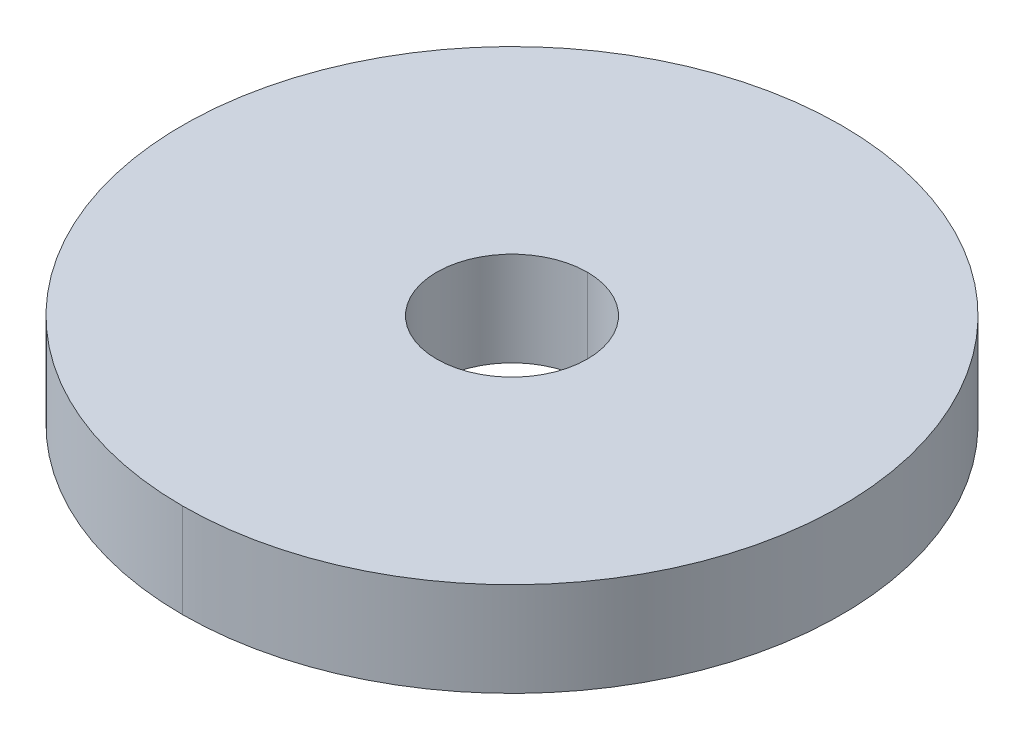
ISO-10303-21;
HEADER;
FILE_DESCRIPTION(('STEP AP214'),'2;1');
FILE_NAME('part.step','',(''),(''),'','','');
FILE_SCHEMA(('AUTOMOTIVE_DESIGN { 1 0 10303 214 1 1 1 1 }'));
ENDSEC;
DATA;
#1=APPLICATION_CONTEXT('core data for automotive mechanical design processes');
#2=APPLICATION_PROTOCOL_DEFINITION('international standard','automotive_design',2000,#1);
#3=PRODUCT_CONTEXT('',#1,'mechanical');
#4=PRODUCT('Part','Part','',(#3));
#5=PRODUCT_RELATED_PRODUCT_CATEGORY('part','',(#4));
#6=PRODUCT_DEFINITION_FORMATION('','',#4);
#7=PRODUCT_DEFINITION_CONTEXT('part definition',#1,'design');
#8=PRODUCT_DEFINITION('design','',#6,#7);
#9=PRODUCT_DEFINITION_SHAPE('','',#8);
#10=(LENGTH_UNIT() NAMED_UNIT(*) SI_UNIT(.MILLI.,.METRE.));
#11=(NAMED_UNIT(*) PLANE_ANGLE_UNIT() SI_UNIT($,.RADIAN.));
#12=(NAMED_UNIT(*) SI_UNIT($,.STERADIAN.) SOLID_ANGLE_UNIT());
#13=UNCERTAINTY_MEASURE_WITH_UNIT(LENGTH_MEASURE(1.E-05),#10,'distance_accuracy_value','');
#14=(GEOMETRIC_REPRESENTATION_CONTEXT(3) GLOBAL_UNCERTAINTY_ASSIGNED_CONTEXT((#13)) GLOBAL_UNIT_ASSIGNED_CONTEXT((#10,
#11,#12)) REPRESENTATION_CONTEXT('',''));
#15=CARTESIAN_POINT('',(0.,0.,0.));
#16=DIRECTION('',(0.,0.,1.));
#17=DIRECTION('',(1.,0.,0.));
#18=AXIS2_PLACEMENT_3D('',#15,#16,#17);
#19=CARTESIAN_POINT('',(0.,2.,0.));
#20=DIRECTION('',(0.,-1.,0.));
#21=DIRECTION('',(0.,0.,-1.));
#22=AXIS2_PLACEMENT_3D('',#19,#20,#21);
#23=CYLINDRICAL_SURFACE('',#22,1.6);
#24=CARTESIAN_POINT('',(0.,2.,0.));
#25=DIRECTION('',(0.,1.,0.));
#26=DIRECTION('',(0.,0.,1.));
#27=AXIS2_PLACEMENT_3D('',#24,#25,#26);
#28=CIRCLE('',#27,1.6);
#29=CARTESIAN_POINT('',(0.,2.,-1.6));
#30=VERTEX_POINT('',#29);
#31=CARTESIAN_POINT('',(0.,2.,1.6));
#32=VERTEX_POINT('',#31);
#33=EDGE_CURVE('E11',#30,#32,#28,.T.);
#34=ORIENTED_EDGE('',*,*,#33,.T.);
#35=DIRECTION('',(0.,-1.,0.));
#36=VECTOR('',#35,1.);
#37=CARTESIAN_POINT('',(0.,2.,1.6));
#38=LINE('',#37,#36);
#39=CARTESIAN_POINT('',(0.,0.,1.6));
#40=VERTEX_POINT('',#39);
#41=EDGE_CURVE('E27',#32,#40,#38,.T.);
#42=ORIENTED_EDGE('',*,*,#41,.T.);
#43=CARTESIAN_POINT('',(0.,0.,0.));
#44=DIRECTION('',(0.,1.,0.));
#45=DIRECTION('',(0.,0.,1.));
#46=AXIS2_PLACEMENT_3D('',#43,#44,#45);
#47=CIRCLE('',#46,1.6);
#48=CARTESIAN_POINT('',(0.,0.,-1.6));
#49=VERTEX_POINT('',#48);
#50=EDGE_CURVE('E20',#49,#40,#47,.T.);
#51=ORIENTED_EDGE('',*,*,#50,.F.);
#52=DIRECTION('',(0.,-1.,0.));
#53=VECTOR('',#52,1.);
#54=CARTESIAN_POINT('',(0.,2.,-1.6));
#55=LINE('',#54,#53);
#56=EDGE_CURVE('E101',#30,#49,#55,.T.);
#57=ORIENTED_EDGE('',*,*,#56,.F.);
#58=EDGE_LOOP('',(#34,#42,#51,#57));
#59=FACE_BOUND('',#58,.T.);
#60=ADVANCED_FACE('F16',(#59),#23,.F.);
#61=CARTESIAN_POINT('',(0.,2.,0.));
#62=DIRECTION('',(0.,-1.,0.));
#63=DIRECTION('',(0.,0.,-1.));
#64=AXIS2_PLACEMENT_3D('',#61,#62,#63);
#65=CYLINDRICAL_SURFACE('',#64,7.);
#66=CARTESIAN_POINT('',(0.,2.,0.));
#67=DIRECTION('',(0.,1.,0.));
#68=DIRECTION('',(0.,0.,1.));
#69=AXIS2_PLACEMENT_3D('',#66,#67,#68);
#70=CIRCLE('',#69,7.);
#71=CARTESIAN_POINT('',(0.,2.,7.));
#72=VERTEX_POINT('',#71);
#73=CARTESIAN_POINT('',(0.,2.,-7.));
#74=VERTEX_POINT('',#73);
#75=EDGE_CURVE('E71',#72,#74,#70,.T.);
#76=ORIENTED_EDGE('',*,*,#75,.F.);
#77=DIRECTION('',(0.,-1.,0.));
#78=VECTOR('',#77,1.);
#79=CARTESIAN_POINT('',(0.,2.,7.));
#80=LINE('',#79,#78);
#81=CARTESIAN_POINT('',(0.,0.,7.));
#82=VERTEX_POINT('',#81);
#83=EDGE_CURVE('E87',#72,#82,#80,.T.);
#84=ORIENTED_EDGE('',*,*,#83,.T.);
#85=CARTESIAN_POINT('',(0.,0.,0.));
#86=DIRECTION('',(0.,1.,0.));
#87=DIRECTION('',(0.,0.,1.));
#88=AXIS2_PLACEMENT_3D('',#85,#86,#87);
#89=CIRCLE('',#88,7.);
#90=CARTESIAN_POINT('',(0.,0.,-7.));
#91=VERTEX_POINT('',#90);
#92=EDGE_CURVE('E73',#82,#91,#89,.T.);
#93=ORIENTED_EDGE('',*,*,#92,.T.);
#94=DIRECTION('',(0.,-1.,0.));
#95=VECTOR('',#94,1.);
#96=CARTESIAN_POINT('',(0.,2.,-7.));
#97=LINE('',#96,#95);
#98=EDGE_CURVE('E58',#74,#91,#97,.T.);
#99=ORIENTED_EDGE('',*,*,#98,.F.);
#100=EDGE_LOOP('',(#76,#84,#93,#99));
#101=FACE_BOUND('',#100,.T.);
#102=ADVANCED_FACE('F18',(#101),#65,.T.);
#103=CARTESIAN_POINT('',(0.,2.,0.));
#104=DIRECTION('',(0.,1.,0.));
#105=DIRECTION('',(1.,0.,0.));
#106=AXIS2_PLACEMENT_3D('',#103,#104,#105);
#107=PLANE('',#106);
#108=CARTESIAN_POINT('',(0.,2.,0.));
#109=DIRECTION('',(0.,1.,0.));
#110=DIRECTION('',(0.,0.,1.));
#111=AXIS2_PLACEMENT_3D('',#108,#109,#110);
#112=CIRCLE('',#111,7.);
#113=EDGE_CURVE('E83',#74,#72,#112,.T.);
#114=ORIENTED_EDGE('',*,*,#113,.T.);
#115=ORIENTED_EDGE('',*,*,#75,.T.);
#116=EDGE_LOOP('',(#114,#115));
#117=FACE_BOUND('',#116,.T.);
#118=ORIENTED_EDGE('',*,*,#33,.F.);
#119=CARTESIAN_POINT('',(0.,2.,0.));
#120=DIRECTION('',(0.,1.,0.));
#121=DIRECTION('',(0.,0.,1.));
#122=AXIS2_PLACEMENT_3D('',#119,#120,#121);
#123=CIRCLE('',#122,1.6);
#124=EDGE_CURVE('E100',#32,#30,#123,.T.);
#125=ORIENTED_EDGE('',*,*,#124,.F.);
#126=EDGE_LOOP('',(#118,#125));
#127=FACE_BOUND('',#126,.T.);
#128=ADVANCED_FACE('F81',(#117,#127),#107,.T.);
#129=CARTESIAN_POINT('',(0.,0.,0.));
#130=DIRECTION('',(0.,1.,0.));
#131=DIRECTION('',(1.,0.,0.));
#132=AXIS2_PLACEMENT_3D('',#129,#130,#131);
#133=PLANE('',#132);
#134=CARTESIAN_POINT('',(0.,0.,0.));
#135=DIRECTION('',(0.,1.,0.));
#136=DIRECTION('',(0.,0.,1.));
#137=AXIS2_PLACEMENT_3D('',#134,#135,#136);
#138=CIRCLE('',#137,7.);
#139=EDGE_CURVE('E77',#91,#82,#138,.T.);
#140=ORIENTED_EDGE('',*,*,#139,.F.);
#141=ORIENTED_EDGE('',*,*,#92,.F.);
#142=EDGE_LOOP('',(#140,#141));
#143=FACE_BOUND('',#142,.T.);
#144=ORIENTED_EDGE('',*,*,#50,.T.);
#145=CARTESIAN_POINT('',(0.,0.,0.));
#146=DIRECTION('',(0.,1.,0.));
#147=DIRECTION('',(0.,0.,1.));
#148=AXIS2_PLACEMENT_3D('',#145,#146,#147);
#149=CIRCLE('',#148,1.6);
#150=EDGE_CURVE('E76',#40,#49,#149,.T.);
#151=ORIENTED_EDGE('',*,*,#150,.T.);
#152=EDGE_LOOP('',(#144,#151));
#153=FACE_BOUND('',#152,.T.);
#154=ADVANCED_FACE('F118',(#143,#153),#133,.F.);
#155=CARTESIAN_POINT('',(0.,2.,0.));
#156=DIRECTION('',(0.,-1.,0.));
#157=DIRECTION('',(0.,0.,-1.));
#158=AXIS2_PLACEMENT_3D('',#155,#156,#157);
#159=CYLINDRICAL_SURFACE('',#158,7.);
#160=ORIENTED_EDGE('',*,*,#83,.F.);
#161=ORIENTED_EDGE('',*,*,#113,.F.);
#162=ORIENTED_EDGE('',*,*,#98,.T.);
#163=ORIENTED_EDGE('',*,*,#139,.T.);
#164=EDGE_LOOP('',(#160,#161,#162,#163));
#165=FACE_BOUND('',#164,.T.);
#166=ADVANCED_FACE('F86',(#165),#159,.T.);
#167=CARTESIAN_POINT('',(0.,2.,0.));
#168=DIRECTION('',(0.,-1.,0.));
#169=DIRECTION('',(0.,0.,-1.));
#170=AXIS2_PLACEMENT_3D('',#167,#168,#169);
#171=CYLINDRICAL_SURFACE('',#170,1.6);
#172=ORIENTED_EDGE('',*,*,#41,.F.);
#173=ORIENTED_EDGE('',*,*,#124,.T.);
#174=ORIENTED_EDGE('',*,*,#56,.T.);
#175=ORIENTED_EDGE('',*,*,#150,.F.);
#176=EDGE_LOOP('',(#172,#173,#174,#175));
#177=FACE_BOUND('',#176,.T.);
#178=ADVANCED_FACE('F109',(#177),#171,.F.);
#179=CLOSED_SHELL('',(#60,#102,#128,#154,#166,#178));
#180=MANIFOLD_SOLID_BREP('B1',#179);
#181=ADVANCED_BREP_SHAPE_REPRESENTATION('',(#18,#180),#14);
#182=SHAPE_DEFINITION_REPRESENTATION(#9,#181);
ENDSEC;
END-ISO-10303-21;
